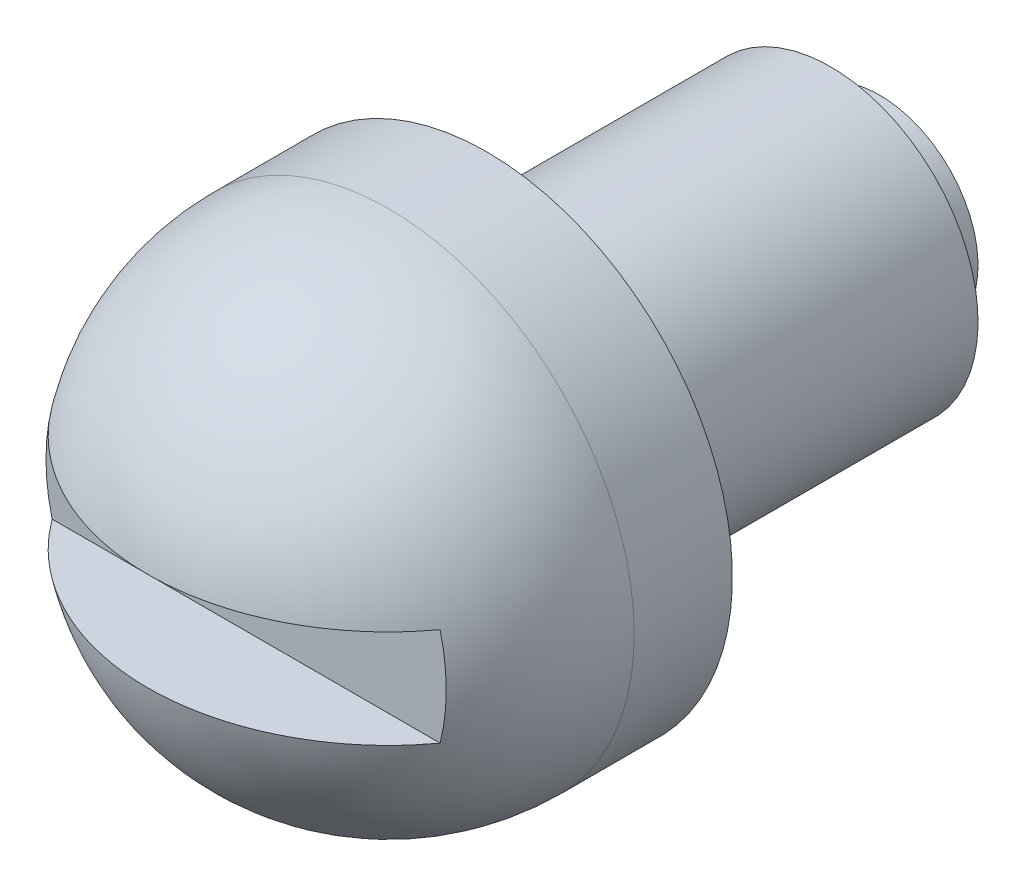
ISO-10303-21;
HEADER;
FILE_DESCRIPTION(('STEP AP214'),'2;1');
FILE_NAME('part.step','',(''),(''),'','','');
FILE_SCHEMA(('AUTOMOTIVE_DESIGN { 1 0 10303 214 1 1 1 1 }'));
ENDSEC;
DATA;
#1=APPLICATION_CONTEXT('core data for automotive mechanical design processes');
#2=APPLICATION_PROTOCOL_DEFINITION('international standard','automotive_design',2000,#1);
#3=PRODUCT_CONTEXT('',#1,'mechanical');
#4=PRODUCT('Part','Part','',(#3));
#5=PRODUCT_RELATED_PRODUCT_CATEGORY('part','',(#4));
#6=PRODUCT_DEFINITION_FORMATION('','',#4);
#7=PRODUCT_DEFINITION_CONTEXT('part definition',#1,'design');
#8=PRODUCT_DEFINITION('design','',#6,#7);
#9=PRODUCT_DEFINITION_SHAPE('','',#8);
#10=(LENGTH_UNIT() NAMED_UNIT(*) SI_UNIT(.MILLI.,.METRE.));
#11=(NAMED_UNIT(*) PLANE_ANGLE_UNIT() SI_UNIT($,.RADIAN.));
#12=(NAMED_UNIT(*) SI_UNIT($,.STERADIAN.) SOLID_ANGLE_UNIT());
#13=UNCERTAINTY_MEASURE_WITH_UNIT(LENGTH_MEASURE(1.E-05),#10,'distance_accuracy_value','');
#14=(GEOMETRIC_REPRESENTATION_CONTEXT(3) GLOBAL_UNCERTAINTY_ASSIGNED_CONTEXT((#13)) GLOBAL_UNIT_ASSIGNED_CONTEXT((#10,
#11,#12)) REPRESENTATION_CONTEXT('',''));
#15=CARTESIAN_POINT('',(0.,0.,0.));
#16=DIRECTION('',(0.,0.,1.));
#17=DIRECTION('',(1.,0.,0.));
#18=AXIS2_PLACEMENT_3D('',#15,#16,#17);
#19=CARTESIAN_POINT('',(0.,0.,-2.27405857740592));
#20=DIRECTION('',(0.,0.,1.));
#21=DIRECTION('',(0.,-1.,0.));
#22=AXIS2_PLACEMENT_3D('',#19,#20,#21);
#23=PLANE('',#22);
#24=CARTESIAN_POINT('',(0.,0.,-2.27405857740592));
#25=DIRECTION('',(0.,0.,1.));
#26=DIRECTION('',(0.,-1.,0.));
#27=AXIS2_PLACEMENT_3D('',#24,#25,#26);
#28=CIRCLE('',#27,2.);
#29=CARTESIAN_POINT('',(0.,-2.,-2.27405857740592));
#30=VERTEX_POINT('',#29);
#31=EDGE_CURVE('E77',#30,#30,#28,.T.);
#32=ORIENTED_EDGE('',*,*,#31,.F.);
#33=EDGE_LOOP('',(#32));
#34=FACE_BOUND('',#33,.T.);
#35=ADVANCED_FACE('F43',(#34),#23,.F.);
#36=CARTESIAN_POINT('',(7.7715611723761E-13,-1.77635683940025E-12,24.));
#37=DIRECTION('',(0.,0.,1.));
#38=DIRECTION('',(0.,-1.,0.));
#39=AXIS2_PLACEMENT_3D('',#36,#37,#38);
#40=CYLINDRICAL_SURFACE('',#39,2.);
#41=CARTESIAN_POINT('',(0.,0.,-1.27405857740581));
#42=DIRECTION('',(0.,0.,1.));
#43=DIRECTION('',(0.,-1.,0.));
#44=AXIS2_PLACEMENT_3D('',#41,#42,#43);
#45=CIRCLE('',#44,2.);
#46=CARTESIAN_POINT('',(0.,-2.,-1.27405857740581));
#47=VERTEX_POINT('',#46);
#48=EDGE_CURVE('E95',#47,#47,#45,.T.);
#49=ORIENTED_EDGE('',*,*,#48,.F.);
#50=EDGE_LOOP('',(#49));
#51=FACE_BOUND('',#50,.T.);
#52=ORIENTED_EDGE('',*,*,#31,.T.);
#53=EDGE_LOOP('',(#52));
#54=FACE_BOUND('',#53,.T.);
#55=ADVANCED_FACE('F121',(#51,#54),#40,.T.);
#56=CARTESIAN_POINT('',(9.99200722162641E-13,1.99999999999889,-1.27405857740581));
#57=DIRECTION('',(0.,0.,1.));
#58=DIRECTION('',(0.,-1.,0.));
#59=AXIS2_PLACEMENT_3D('',#56,#57,#58);
#60=PLANE('',#59);
#61=CARTESIAN_POINT('',(0.,0.,-1.27405857740581));
#62=DIRECTION('',(0.,0.,1.));
#63=DIRECTION('',(0.,-1.,0.));
#64=AXIS2_PLACEMENT_3D('',#61,#62,#63);
#65=CIRCLE('',#64,3.);
#66=CARTESIAN_POINT('',(0.,-3.,-1.27405857740581));
#67=VERTEX_POINT('',#66);
#68=EDGE_CURVE('E96',#67,#67,#65,.T.);
#69=ORIENTED_EDGE('',*,*,#68,.F.);
#70=EDGE_LOOP('',(#69));
#71=FACE_BOUND('',#70,.T.);
#72=ORIENTED_EDGE('',*,*,#48,.T.);
#73=EDGE_LOOP('',(#72));
#74=FACE_BOUND('',#73,.T.);
#75=ADVANCED_FACE('F132',(#71,#74),#60,.F.);
#76=CARTESIAN_POINT('',(7.7715611723761E-13,-1.77635683940025E-12,24.));
#77=DIRECTION('',(0.,0.,1.));
#78=DIRECTION('',(0.,-1.,0.));
#79=AXIS2_PLACEMENT_3D('',#76,#77,#78);
#80=CYLINDRICAL_SURFACE('',#79,3.);
#81=CARTESIAN_POINT('',(0.,0.,5.72594142259408));
#82=DIRECTION('',(0.,0.,1.));
#83=DIRECTION('',(0.,-1.,0.));
#84=AXIS2_PLACEMENT_3D('',#81,#82,#83);
#85=CIRCLE('',#84,3.);
#86=CARTESIAN_POINT('',(0.,-3.,5.72594142259408));
#87=VERTEX_POINT('',#86);
#88=EDGE_CURVE('E99',#87,#87,#85,.T.);
#89=ORIENTED_EDGE('',*,*,#88,.F.);
#90=EDGE_LOOP('',(#89));
#91=FACE_BOUND('',#90,.T.);
#92=ORIENTED_EDGE('',*,*,#68,.T.);
#93=EDGE_LOOP('',(#92));
#94=FACE_BOUND('',#93,.T.);
#95=ADVANCED_FACE('F140',(#91,#94),#80,.T.);
#96=CARTESIAN_POINT('',(1.22124532708767E-12,2.99999999999834,5.72594142259408));
#97=DIRECTION('',(0.,0.,1.));
#98=DIRECTION('',(0.,-1.,0.));
#99=AXIS2_PLACEMENT_3D('',#96,#97,#98);
#100=PLANE('',#99);
#101=CARTESIAN_POINT('',(0.,0.,5.72594142259408));
#102=DIRECTION('',(0.,0.,1.));
#103=DIRECTION('',(0.,-1.,0.));
#104=AXIS2_PLACEMENT_3D('',#101,#102,#103);
#105=CIRCLE('',#104,5.);
#106=CARTESIAN_POINT('',(0.,-5.,5.72594142259408));
#107=VERTEX_POINT('',#106);
#108=EDGE_CURVE('E102',#107,#107,#105,.T.);
#109=ORIENTED_EDGE('',*,*,#108,.F.);
#110=EDGE_LOOP('',(#109));
#111=FACE_BOUND('',#110,.T.);
#112=ORIENTED_EDGE('',*,*,#88,.T.);
#113=EDGE_LOOP('',(#112));
#114=FACE_BOUND('',#113,.T.);
#115=ADVANCED_FACE('F148',(#111,#114),#100,.F.);
#116=CARTESIAN_POINT('',(7.7715611723761E-13,-1.77635683940025E-12,24.));
#117=DIRECTION('',(0.,0.,1.));
#118=DIRECTION('',(0.,-1.,0.));
#119=AXIS2_PLACEMENT_3D('',#116,#117,#118);
#120=CYLINDRICAL_SURFACE('',#119,5.);
#121=CARTESIAN_POINT('',(0.,0.,7.72594142259431));
#122=DIRECTION('',(0.,0.,1.));
#123=DIRECTION('',(0.,-1.,0.));
#124=AXIS2_PLACEMENT_3D('',#121,#122,#123);
#125=CIRCLE('',#124,5.);
#126=CARTESIAN_POINT('',(0.,-5.,7.72594142259431));
#127=VERTEX_POINT('',#126);
#128=EDGE_CURVE('E107',#127,#127,#125,.T.);
#129=ORIENTED_EDGE('',*,*,#128,.F.);
#130=EDGE_LOOP('',(#129));
#131=FACE_BOUND('',#130,.T.);
#132=ORIENTED_EDGE('',*,*,#108,.T.);
#133=EDGE_LOOP('',(#132));
#134=FACE_BOUND('',#133,.T.);
#135=ADVANCED_FACE('F147',(#131,#134),#120,.T.);
#136=CARTESIAN_POINT('',(0.,0.,7.72594142259431));
#137=DIRECTION('',(0.,0.,1.));
#138=DIRECTION('',(0.,1.,0.));
#139=AXIS2_PLACEMENT_3D('',#136,#137,#138);
#140=SPHERICAL_SURFACE('',#139,5.);
#141=CARTESIAN_POINT('',(1.11022302462516E-13,0.,10.6249209081604));
#142=DIRECTION('',(0.,0.,-1.));
#143=DIRECTION('',(-1.,0.,0.));
#144=AXIS2_PLACEMENT_3D('',#141,#142,#143);
#145=CIRCLE('',#144,4.07380877585895);
#146=CARTESIAN_POINT('',(3.94916674024703,0.999999999999002,10.6249209081606));
#147=VERTEX_POINT('',#146);
#148=CARTESIAN_POINT('',(3.94916674024626,-1.00000000000033,10.6249209081606));
#149=VERTEX_POINT('',#148);
#150=EDGE_CURVE('E51',#147,#149,#145,.T.);
#151=ORIENTED_EDGE('',*,*,#150,.T.);
#152=CARTESIAN_POINT('',(3.33066907387547E-13,-1.00000000000078,7.72594142259431));
#153=DIRECTION('',(0.,-1.,0.));
#154=DIRECTION('',(0.,0.,-1.));
#155=AXIS2_PLACEMENT_3D('',#152,#153,#154);
#156=CIRCLE('',#155,4.89897948556635);
#157=CARTESIAN_POINT('',(-3.94916674024581,-1.00000000000033,10.6249209081604));
#158=VERTEX_POINT('',#157);
#159=EDGE_CURVE('E11',#149,#158,#156,.T.);
#160=ORIENTED_EDGE('',*,*,#159,.T.);
#161=CARTESIAN_POINT('',(-3.94916674024448,0.999999999998114,10.6249209081613));
#162=VERTEX_POINT('',#161);
#163=EDGE_CURVE('E73',#158,#162,#145,.T.);
#164=ORIENTED_EDGE('',*,*,#163,.T.);
#165=CARTESIAN_POINT('',(-2.22044604925031E-13,1.00000000000033,7.72594142259408));
#166=DIRECTION('',(0.,1.,0.));
#167=DIRECTION('',(0.,0.,1.));
#168=AXIS2_PLACEMENT_3D('',#165,#166,#167);
#169=CIRCLE('',#168,4.89897948556636);
#170=EDGE_CURVE('E70',#162,#147,#169,.T.);
#171=ORIENTED_EDGE('',*,*,#170,.T.);
#172=EDGE_LOOP('',(#151,#160,#164,#171));
#173=FACE_BOUND('',#172,.T.);
#174=ORIENTED_EDGE('',*,*,#128,.T.);
#175=EDGE_LOOP('',(#174));
#176=FACE_BOUND('',#175,.T.);
#177=ADVANCED_FACE('F82',(#173,#176),#140,.T.);
#178=CARTESIAN_POINT('',(-5.,0.99999999999989,10.6249209081613));
#179=DIRECTION('',(0.,0.,-1.));
#180=DIRECTION('',(-1.,0.,0.));
#181=AXIS2_PLACEMENT_3D('',#178,#179,#180);
#182=PLANE('',#181);
#183=DIRECTION('',(1.,0.,0.));
#184=VECTOR('',#183,1.);
#185=CARTESIAN_POINT('',(-5.,0.99999999999989,10.6249209081613));
#186=LINE('',#185,#184);
#187=EDGE_CURVE('E60',#162,#147,#186,.T.);
#188=ORIENTED_EDGE('',*,*,#187,.F.);
#189=ORIENTED_EDGE('',*,*,#163,.F.);
#190=DIRECTION('',(1.,0.,0.));
#191=VECTOR('',#190,1.);
#192=CARTESIAN_POINT('',(-5.00000000000023,-1.00000000000033,10.6249209081604));
#193=LINE('',#192,#191);
#194=EDGE_CURVE('E83',#158,#149,#193,.T.);
#195=ORIENTED_EDGE('',*,*,#194,.T.);
#196=ORIENTED_EDGE('',*,*,#150,.F.);
#197=EDGE_LOOP('',(#188,#189,#195,#196));
#198=FACE_BOUND('',#197,.T.);
#199=ADVANCED_FACE('F76',(#198),#182,.F.);
#200=CARTESIAN_POINT('',(-4.99999999999901,-1.00000000000211,14.8269619370278));
#201=DIRECTION('',(0.,-1.,0.));
#202=DIRECTION('',(0.,0.,-1.));
#203=AXIS2_PLACEMENT_3D('',#200,#201,#202);
#204=PLANE('',#203);
#205=ORIENTED_EDGE('',*,*,#194,.F.);
#206=ORIENTED_EDGE('',*,*,#159,.F.);
#207=EDGE_LOOP('',(#205,#206));
#208=FACE_BOUND('',#207,.T.);
#209=ADVANCED_FACE('F111',(#208),#204,.F.);
#210=CARTESIAN_POINT('',(-5.,0.99999999999989,14.8269619370285));
#211=DIRECTION('',(0.,1.,0.));
#212=DIRECTION('',(0.,0.,1.));
#213=AXIS2_PLACEMENT_3D('',#210,#211,#212);
#214=PLANE('',#213);
#215=ORIENTED_EDGE('',*,*,#187,.T.);
#216=ORIENTED_EDGE('',*,*,#170,.F.);
#217=EDGE_LOOP('',(#215,#216));
#218=FACE_BOUND('',#217,.T.);
#219=ADVANCED_FACE('F66',(#218),#214,.F.);
#220=CLOSED_SHELL('',(#35,#55,#75,#95,#115,#135,#177,#199,#209,#219));
#221=MANIFOLD_SOLID_BREP('B2',#220);
#222=ADVANCED_BREP_SHAPE_REPRESENTATION('',(#18,#221),#14);
#223=SHAPE_DEFINITION_REPRESENTATION(#9,#222);
ENDSEC;
END-ISO-10303-21;
